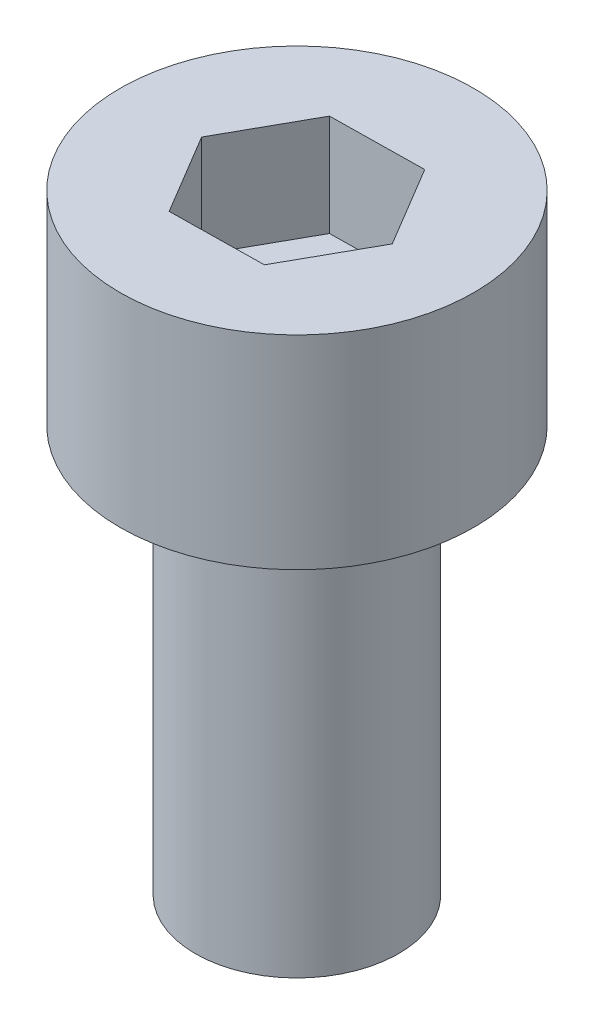
ISO-10303-21;
HEADER;
FILE_DESCRIPTION(('STEP AP214'),'2;1');
FILE_NAME('part.step','',(''),(''),'','','');
FILE_SCHEMA(('AUTOMOTIVE_DESIGN { 1 0 10303 214 1 1 1 1 }'));
ENDSEC;
DATA;
#1=APPLICATION_CONTEXT('core data for automotive mechanical design processes');
#2=APPLICATION_PROTOCOL_DEFINITION('international standard','automotive_design',2000,#1);
#3=PRODUCT_CONTEXT('',#1,'mechanical');
#4=PRODUCT('Part','Part','',(#3));
#5=PRODUCT_RELATED_PRODUCT_CATEGORY('part','',(#4));
#6=PRODUCT_DEFINITION_FORMATION('','',#4);
#7=PRODUCT_DEFINITION_CONTEXT('part definition',#1,'design');
#8=PRODUCT_DEFINITION('design','',#6,#7);
#9=PRODUCT_DEFINITION_SHAPE('','',#8);
#10=(LENGTH_UNIT() NAMED_UNIT(*) SI_UNIT(.MILLI.,.METRE.));
#11=(NAMED_UNIT(*) PLANE_ANGLE_UNIT() SI_UNIT($,.RADIAN.));
#12=(NAMED_UNIT(*) SI_UNIT($,.STERADIAN.) SOLID_ANGLE_UNIT());
#13=UNCERTAINTY_MEASURE_WITH_UNIT(LENGTH_MEASURE(1.E-05),#10,'distance_accuracy_value','');
#14=(GEOMETRIC_REPRESENTATION_CONTEXT(3) GLOBAL_UNCERTAINTY_ASSIGNED_CONTEXT((#13)) GLOBAL_UNIT_ASSIGNED_CONTEXT((#10,
#11,#12)) REPRESENTATION_CONTEXT('',''));
#15=CARTESIAN_POINT('',(0.,0.,0.));
#16=DIRECTION('',(0.,0.,1.));
#17=DIRECTION('',(1.,0.,0.));
#18=AXIS2_PLACEMENT_3D('',#15,#16,#17);
#19=CARTESIAN_POINT('',(0.,10.,0.));
#20=DIRECTION('',(0.,-1.,0.));
#21=DIRECTION('',(0.,0.,-1.));
#22=AXIS2_PLACEMENT_3D('',#19,#20,#21);
#23=CYLINDRICAL_SURFACE('',#22,2.5);
#24=CARTESIAN_POINT('',(0.,10.,0.));
#25=DIRECTION('',(0.,1.,0.));
#26=DIRECTION('',(0.,0.,1.));
#27=AXIS2_PLACEMENT_3D('',#24,#25,#26);
#28=CIRCLE('',#27,2.5);
#29=CARTESIAN_POINT('',(0.,10.,2.5));
#30=VERTEX_POINT('',#29);
#31=EDGE_CURVE('E11',#30,#30,#28,.T.);
#32=ORIENTED_EDGE('',*,*,#31,.F.);
#33=EDGE_LOOP('',(#32));
#34=FACE_BOUND('',#33,.T.);
#35=CARTESIAN_POINT('',(0.,0.,0.));
#36=DIRECTION('',(0.,1.,0.));
#37=DIRECTION('',(0.,0.,1.));
#38=AXIS2_PLACEMENT_3D('',#35,#36,#37);
#39=CIRCLE('',#38,2.5);
#40=CARTESIAN_POINT('',(0.,0.,2.5));
#41=VERTEX_POINT('',#40);
#42=EDGE_CURVE('E24',#41,#41,#39,.T.);
#43=ORIENTED_EDGE('',*,*,#42,.T.);
#44=EDGE_LOOP('',(#43));
#45=FACE_BOUND('',#44,.T.);
#46=ADVANCED_FACE('F17',(#34,#45),#23,.T.);
#47=CARTESIAN_POINT('',(0.,0.,0.));
#48=DIRECTION('',(0.,1.,0.));
#49=DIRECTION('',(0.,0.,1.));
#50=AXIS2_PLACEMENT_3D('',#47,#48,#49);
#51=PLANE('',#50);
#52=ORIENTED_EDGE('',*,*,#42,.F.);
#53=EDGE_LOOP('',(#52));
#54=FACE_BOUND('',#53,.T.);
#55=ADVANCED_FACE('F132',(#54),#51,.F.);
#56=CARTESIAN_POINT('',(0.,15.,0.));
#57=DIRECTION('',(0.,-1.,0.));
#58=DIRECTION('',(0.,0.,-1.));
#59=AXIS2_PLACEMENT_3D('',#56,#57,#58);
#60=CYLINDRICAL_SURFACE('',#59,4.35);
#61=CARTESIAN_POINT('',(0.,15.,0.));
#62=DIRECTION('',(0.,1.,0.));
#63=DIRECTION('',(0.,0.,1.));
#64=AXIS2_PLACEMENT_3D('',#61,#62,#63);
#65=CIRCLE('',#64,4.35);
#66=CARTESIAN_POINT('',(0.,15.,4.35));
#67=VERTEX_POINT('',#66);
#68=EDGE_CURVE('E126',#67,#67,#65,.T.);
#69=ORIENTED_EDGE('',*,*,#68,.F.);
#70=EDGE_LOOP('',(#69));
#71=FACE_BOUND('',#70,.T.);
#72=CARTESIAN_POINT('',(0.,10.,0.));
#73=DIRECTION('',(0.,1.,0.));
#74=DIRECTION('',(0.,0.,1.));
#75=AXIS2_PLACEMENT_3D('',#72,#73,#74);
#76=CIRCLE('',#75,4.35);
#77=CARTESIAN_POINT('',(0.,10.,4.35));
#78=VERTEX_POINT('',#77);
#79=EDGE_CURVE('E123',#78,#78,#76,.T.);
#80=ORIENTED_EDGE('',*,*,#79,.T.);
#81=EDGE_LOOP('',(#80));
#82=FACE_BOUND('',#81,.T.);
#83=ADVANCED_FACE('F134',(#71,#82),#60,.T.);
#84=CARTESIAN_POINT('',(0.,15.,0.));
#85=DIRECTION('',(0.,1.,0.));
#86=DIRECTION('',(0.,0.,1.));
#87=AXIS2_PLACEMENT_3D('',#84,#85,#86);
#88=PLANE('',#87);
#89=DIRECTION('',(0.999893086922528,0.,-0.0146224048821465));
#90=VECTOR('',#89,1.);
#91=CARTESIAN_POINT('',(-1.12533227602684,15.,2.01667067263487));
#92=LINE('',#91,#90);
#93=CARTESIAN_POINT('',(-1.12533227602684,15.,2.01667067263487));
#94=VERTEX_POINT('',#93);
#95=CARTESIAN_POINT('',(1.18382189555543,15.,1.98290167505524));
#96=VERTEX_POINT('',#95);
#97=EDGE_CURVE('E31',#94,#96,#92,.T.);
#98=ORIENTED_EDGE('',*,*,#97,.F.);
#99=DIRECTION('',(0.512609917553624,0.,0.858621611902278));
#100=VECTOR('',#99,1.);
#101=CARTESIAN_POINT('',(-2.30915417158227,15.,0.0337689975796269));
#102=LINE('',#101,#100);
#103=CARTESIAN_POINT('',(-2.30915417158227,15.,0.0337689975796269));
#104=VERTEX_POINT('',#103);
#105=EDGE_CURVE('E36',#104,#94,#102,.T.);
#106=ORIENTED_EDGE('',*,*,#105,.F.);
#107=DIRECTION('',(-0.487283169368904,0.,0.873244016784424));
#108=VECTOR('',#107,1.);
#109=CARTESIAN_POINT('',(-1.18382189555543,15.,-1.98290167505524));
#110=LINE('',#109,#108);
#111=CARTESIAN_POINT('',(-1.18382189555543,15.,-1.98290167505524));
#112=VERTEX_POINT('',#111);
#113=EDGE_CURVE('E118',#112,#104,#110,.T.);
#114=ORIENTED_EDGE('',*,*,#113,.F.);
#115=DIRECTION('',(-0.999893086922528,0.,0.0146224048821459));
#116=VECTOR('',#115,1.);
#117=CARTESIAN_POINT('',(1.12533227602684,15.,-2.01667067263487));
#118=LINE('',#117,#116);
#119=CARTESIAN_POINT('',(1.12533227602684,15.,-2.01667067263487));
#120=VERTEX_POINT('',#119);
#121=EDGE_CURVE('E115',#120,#112,#118,.T.);
#122=ORIENTED_EDGE('',*,*,#121,.F.);
#123=DIRECTION('',(-0.512609917553624,0.,-0.858621611902278));
#124=VECTOR('',#123,1.);
#125=CARTESIAN_POINT('',(2.30915417158227,15.,-0.0337689975796276));
#126=LINE('',#125,#124);
#127=CARTESIAN_POINT('',(2.30915417158227,15.,-0.0337689975796276));
#128=VERTEX_POINT('',#127);
#129=EDGE_CURVE('E113',#128,#120,#126,.T.);
#130=ORIENTED_EDGE('',*,*,#129,.F.);
#131=DIRECTION('',(0.487283169368904,0.,-0.873244016784424));
#132=VECTOR('',#131,1.);
#133=CARTESIAN_POINT('',(1.18382189555543,15.,1.98290167505524));
#134=LINE('',#133,#132);
#135=EDGE_CURVE('E87',#96,#128,#134,.T.);
#136=ORIENTED_EDGE('',*,*,#135,.F.);
#137=EDGE_LOOP('',(#98,#106,#114,#122,#130,#136));
#138=FACE_BOUND('',#137,.T.);
#139=ORIENTED_EDGE('',*,*,#68,.T.);
#140=EDGE_LOOP('',(#139));
#141=FACE_BOUND('',#140,.T.);
#142=ADVANCED_FACE('F140',(#138,#141),#88,.T.);
#143=CARTESIAN_POINT('',(0.,10.,0.));
#144=DIRECTION('',(0.,1.,0.));
#145=DIRECTION('',(0.,0.,1.));
#146=AXIS2_PLACEMENT_3D('',#143,#144,#145);
#147=PLANE('',#146);
#148=ORIENTED_EDGE('',*,*,#31,.T.);
#149=EDGE_LOOP('',(#148));
#150=FACE_BOUND('',#149,.T.);
#151=ORIENTED_EDGE('',*,*,#79,.F.);
#152=EDGE_LOOP('',(#151));
#153=FACE_BOUND('',#152,.T.);
#154=ADVANCED_FACE('F147',(#150,#153),#147,.F.);
#155=CARTESIAN_POINT('',(-1.12533227602684,12.5,2.01667067263487));
#156=DIRECTION('',(0.0146224048821465,0.,0.999893086922528));
#157=DIRECTION('',(0.999893086922528,0.,-0.0146224048821465));
#158=AXIS2_PLACEMENT_3D('',#155,#156,#157);
#159=PLANE('',#158);
#160=ORIENTED_EDGE('',*,*,#97,.T.);
#161=DIRECTION('',(0.,1.,0.));
#162=VECTOR('',#161,1.);
#163=CARTESIAN_POINT('',(1.18382189555543,12.5,1.98290167505524));
#164=LINE('',#163,#162);
#165=CARTESIAN_POINT('',(1.18382189555543,12.5,1.98290167505524));
#166=VERTEX_POINT('',#165);
#167=EDGE_CURVE('E110',#166,#96,#164,.T.);
#168=ORIENTED_EDGE('',*,*,#167,.F.);
#169=DIRECTION('',(0.999893086922528,0.,-0.0146224048821465));
#170=VECTOR('',#169,1.);
#171=CARTESIAN_POINT('',(-1.12533227602684,12.5,2.01667067263487));
#172=LINE('',#171,#170);
#173=CARTESIAN_POINT('',(-1.12533227602684,12.5,2.01667067263487));
#174=VERTEX_POINT('',#173);
#175=EDGE_CURVE('E91',#174,#166,#172,.T.);
#176=ORIENTED_EDGE('',*,*,#175,.F.);
#177=DIRECTION('',(0.,1.,0.));
#178=VECTOR('',#177,1.);
#179=CARTESIAN_POINT('',(-1.12533227602684,12.5,2.01667067263487));
#180=LINE('',#179,#178);
#181=EDGE_CURVE('E107',#174,#94,#180,.T.);
#182=ORIENTED_EDGE('',*,*,#181,.T.);
#183=EDGE_LOOP('',(#160,#168,#176,#182));
#184=FACE_BOUND('',#183,.T.);
#185=ADVANCED_FACE('F150',(#184),#159,.F.);
#186=CARTESIAN_POINT('',(-2.30915417158227,12.5,0.0337689975796269));
#187=DIRECTION('',(-0.858621611902278,0.,0.512609917553624));
#188=DIRECTION('',(0.512609917553624,0.,0.858621611902278));
#189=AXIS2_PLACEMENT_3D('',#186,#187,#188);
#190=PLANE('',#189);
#191=ORIENTED_EDGE('',*,*,#105,.T.);
#192=ORIENTED_EDGE('',*,*,#181,.F.);
#193=DIRECTION('',(0.512609917553624,0.,0.858621611902278));
#194=VECTOR('',#193,1.);
#195=CARTESIAN_POINT('',(-2.30915417158227,12.5,0.0337689975796269));
#196=LINE('',#195,#194);
#197=CARTESIAN_POINT('',(-2.30915417158227,12.5,0.0337689975796269));
#198=VERTEX_POINT('',#197);
#199=EDGE_CURVE('E105',#198,#174,#196,.T.);
#200=ORIENTED_EDGE('',*,*,#199,.F.);
#201=DIRECTION('',(0.,1.,0.));
#202=VECTOR('',#201,1.);
#203=CARTESIAN_POINT('',(-2.30915417158227,12.5,0.0337689975796269));
#204=LINE('',#203,#202);
#205=EDGE_CURVE('E103',#198,#104,#204,.T.);
#206=ORIENTED_EDGE('',*,*,#205,.T.);
#207=EDGE_LOOP('',(#191,#192,#200,#206));
#208=FACE_BOUND('',#207,.T.);
#209=ADVANCED_FACE('F154',(#208),#190,.F.);
#210=CARTESIAN_POINT('',(-1.18382189555543,12.5,-1.98290167505524));
#211=DIRECTION('',(-0.873244016784424,0.,-0.487283169368904));
#212=DIRECTION('',(-0.487283169368904,0.,0.873244016784424));
#213=AXIS2_PLACEMENT_3D('',#210,#211,#212);
#214=PLANE('',#213);
#215=ORIENTED_EDGE('',*,*,#113,.T.);
#216=ORIENTED_EDGE('',*,*,#205,.F.);
#217=DIRECTION('',(-0.487283169368904,0.,0.873244016784424));
#218=VECTOR('',#217,1.);
#219=CARTESIAN_POINT('',(-1.18382189555543,12.5,-1.98290167505524));
#220=LINE('',#219,#218);
#221=CARTESIAN_POINT('',(-1.18382189555543,12.5,-1.98290167505524));
#222=VERTEX_POINT('',#221);
#223=EDGE_CURVE('E100',#222,#198,#220,.T.);
#224=ORIENTED_EDGE('',*,*,#223,.F.);
#225=DIRECTION('',(0.,1.,0.));
#226=VECTOR('',#225,1.);
#227=CARTESIAN_POINT('',(-1.18382189555543,12.5,-1.98290167505524));
#228=LINE('',#227,#226);
#229=EDGE_CURVE('E97',#222,#112,#228,.T.);
#230=ORIENTED_EDGE('',*,*,#229,.T.);
#231=EDGE_LOOP('',(#215,#216,#224,#230));
#232=FACE_BOUND('',#231,.T.);
#233=ADVANCED_FACE('F158',(#232),#214,.F.);
#234=CARTESIAN_POINT('',(1.12533227602684,12.5,-2.01667067263487));
#235=DIRECTION('',(-0.0146224048821459,0.,-0.999893086922528));
#236=DIRECTION('',(-0.999893086922528,0.,0.0146224048821459));
#237=AXIS2_PLACEMENT_3D('',#234,#235,#236);
#238=PLANE('',#237);
#239=ORIENTED_EDGE('',*,*,#121,.T.);
#240=ORIENTED_EDGE('',*,*,#229,.F.);
#241=DIRECTION('',(-0.999893086922528,0.,0.0146224048821459));
#242=VECTOR('',#241,1.);
#243=CARTESIAN_POINT('',(1.12533227602684,12.5,-2.01667067263487));
#244=LINE('',#243,#242);
#245=CARTESIAN_POINT('',(1.12533227602684,12.5,-2.01667067263487));
#246=VERTEX_POINT('',#245);
#247=EDGE_CURVE('E95',#246,#222,#244,.T.);
#248=ORIENTED_EDGE('',*,*,#247,.F.);
#249=DIRECTION('',(0.,1.,0.));
#250=VECTOR('',#249,1.);
#251=CARTESIAN_POINT('',(1.12533227602684,12.5,-2.01667067263487));
#252=LINE('',#251,#250);
#253=EDGE_CURVE('E76',#246,#120,#252,.T.);
#254=ORIENTED_EDGE('',*,*,#253,.T.);
#255=EDGE_LOOP('',(#239,#240,#248,#254));
#256=FACE_BOUND('',#255,.T.);
#257=ADVANCED_FACE('F162',(#256),#238,.F.);
#258=CARTESIAN_POINT('',(2.30915417158227,12.5,-0.0337689975796276));
#259=DIRECTION('',(0.858621611902278,0.,-0.512609917553624));
#260=DIRECTION('',(-0.512609917553624,0.,-0.858621611902278));
#261=AXIS2_PLACEMENT_3D('',#258,#259,#260);
#262=PLANE('',#261);
#263=ORIENTED_EDGE('',*,*,#129,.T.);
#264=ORIENTED_EDGE('',*,*,#253,.F.);
#265=DIRECTION('',(-0.512609917553624,0.,-0.858621611902278));
#266=VECTOR('',#265,1.);
#267=CARTESIAN_POINT('',(2.30915417158227,12.5,-0.0337689975796276));
#268=LINE('',#267,#266);
#269=CARTESIAN_POINT('',(2.30915417158227,12.5,-0.0337689975796276));
#270=VERTEX_POINT('',#269);
#271=EDGE_CURVE('E69',#270,#246,#268,.T.);
#272=ORIENTED_EDGE('',*,*,#271,.F.);
#273=DIRECTION('',(0.,1.,0.));
#274=VECTOR('',#273,1.);
#275=CARTESIAN_POINT('',(2.30915417158227,12.5,-0.0337689975796276));
#276=LINE('',#275,#274);
#277=EDGE_CURVE('E73',#270,#128,#276,.T.);
#278=ORIENTED_EDGE('',*,*,#277,.T.);
#279=EDGE_LOOP('',(#263,#264,#272,#278));
#280=FACE_BOUND('',#279,.T.);
#281=ADVANCED_FACE('F72',(#280),#262,.F.);
#282=CARTESIAN_POINT('',(1.18382189555543,12.5,1.98290167505524));
#283=DIRECTION('',(0.873244016784424,0.,0.487283169368904));
#284=DIRECTION('',(0.487283169368904,0.,-0.873244016784424));
#285=AXIS2_PLACEMENT_3D('',#282,#283,#284);
#286=PLANE('',#285);
#287=ORIENTED_EDGE('',*,*,#135,.T.);
#288=ORIENTED_EDGE('',*,*,#277,.F.);
#289=DIRECTION('',(0.487283169368904,0.,-0.873244016784424));
#290=VECTOR('',#289,1.);
#291=CARTESIAN_POINT('',(1.18382189555543,12.5,1.98290167505524));
#292=LINE('',#291,#290);
#293=EDGE_CURVE('E85',#166,#270,#292,.T.);
#294=ORIENTED_EDGE('',*,*,#293,.F.);
#295=ORIENTED_EDGE('',*,*,#167,.T.);
#296=EDGE_LOOP('',(#287,#288,#294,#295));
#297=FACE_BOUND('',#296,.T.);
#298=ADVANCED_FACE('F83',(#297),#286,.F.);
#299=CARTESIAN_POINT('',(0.,12.5,0.));
#300=DIRECTION('',(0.,1.,0.));
#301=DIRECTION('',(0.,0.,1.));
#302=AXIS2_PLACEMENT_3D('',#299,#300,#301);
#303=PLANE('',#302);
#304=ORIENTED_EDGE('',*,*,#175,.T.);
#305=ORIENTED_EDGE('',*,*,#293,.T.);
#306=ORIENTED_EDGE('',*,*,#271,.T.);
#307=ORIENTED_EDGE('',*,*,#247,.T.);
#308=ORIENTED_EDGE('',*,*,#223,.T.);
#309=ORIENTED_EDGE('',*,*,#199,.T.);
#310=EDGE_LOOP('',(#304,#305,#306,#307,#308,#309));
#311=FACE_BOUND('',#310,.T.);
#312=ADVANCED_FACE('F89',(#311),#303,.T.);
#313=CLOSED_SHELL('',(#46,#55,#83,#142,#154,#185,#209,#233,#257,#281,#298,#312));
#314=MANIFOLD_SOLID_BREP('B1',#313);
#315=ADVANCED_BREP_SHAPE_REPRESENTATION('',(#18,#314),#14);
#316=SHAPE_DEFINITION_REPRESENTATION(#9,#315);
ENDSEC;
END-ISO-10303-21;
